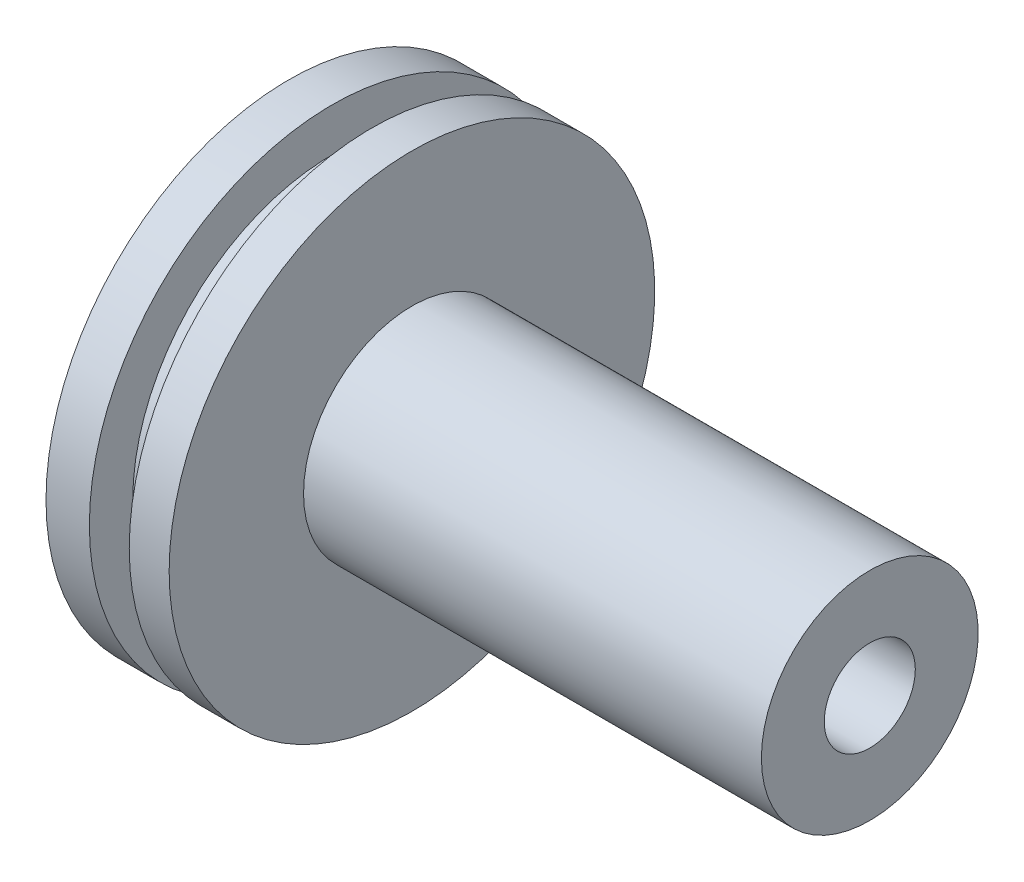
ISO-10303-21;
HEADER;
FILE_DESCRIPTION(('STEP AP214'),'2;1');
FILE_NAME('part.step','',(''),(''),'','','');
FILE_SCHEMA(('AUTOMOTIVE_DESIGN { 1 0 10303 214 1 1 1 1 }'));
ENDSEC;
DATA;
#1=APPLICATION_CONTEXT('core data for automotive mechanical design processes');
#2=APPLICATION_PROTOCOL_DEFINITION('international standard','automotive_design',2000,#1);
#3=PRODUCT_CONTEXT('',#1,'mechanical');
#4=PRODUCT('Part','Part','',(#3));
#5=PRODUCT_RELATED_PRODUCT_CATEGORY('part','',(#4));
#6=PRODUCT_DEFINITION_FORMATION('','',#4);
#7=PRODUCT_DEFINITION_CONTEXT('part definition',#1,'design');
#8=PRODUCT_DEFINITION('design','',#6,#7);
#9=PRODUCT_DEFINITION_SHAPE('','',#8);
#10=(LENGTH_UNIT() NAMED_UNIT(*) SI_UNIT(.MILLI.,.METRE.));
#11=(NAMED_UNIT(*) PLANE_ANGLE_UNIT() SI_UNIT($,.RADIAN.));
#12=(NAMED_UNIT(*) SI_UNIT($,.STERADIAN.) SOLID_ANGLE_UNIT());
#13=UNCERTAINTY_MEASURE_WITH_UNIT(LENGTH_MEASURE(1.E-05),#10,'distance_accuracy_value','');
#14=(GEOMETRIC_REPRESENTATION_CONTEXT(3) GLOBAL_UNCERTAINTY_ASSIGNED_CONTEXT((#13)) GLOBAL_UNIT_ASSIGNED_CONTEXT((#10,
#11,#12)) REPRESENTATION_CONTEXT('',''));
#15=CARTESIAN_POINT('',(0.,0.,0.));
#16=DIRECTION('',(0.,0.,1.));
#17=DIRECTION('',(1.,0.,0.));
#18=AXIS2_PLACEMENT_3D('',#15,#16,#17);
#19=CARTESIAN_POINT('',(0.,-12.5,0.));
#20=DIRECTION('',(1.,0.,0.));
#21=DIRECTION('',(0.,0.,-1.));
#22=AXIS2_PLACEMENT_3D('',#19,#20,#21);
#23=PLANE('',#22);
#24=CARTESIAN_POINT('',(0.,0.,0.));
#25=DIRECTION('',(1.,0.,0.));
#26=DIRECTION('',(0.,0.,-1.));
#27=AXIS2_PLACEMENT_3D('',#24,#25,#26);
#28=CIRCLE('',#27,5.24999999999999);
#29=CARTESIAN_POINT('',(0.,0.,-5.24999999999999));
#30=VERTEX_POINT('',#29);
#31=EDGE_CURVE('E56',#30,#30,#28,.T.);
#32=ORIENTED_EDGE('',*,*,#31,.F.);
#33=EDGE_LOOP('',(#32));
#34=FACE_BOUND('',#33,.T.);
#35=CARTESIAN_POINT('',(0.,0.,0.));
#36=DIRECTION('',(-1.,0.,0.));
#37=DIRECTION('',(0.,0.,1.));
#38=AXIS2_PLACEMENT_3D('',#35,#36,#37);
#39=CIRCLE('',#38,12.5);
#40=CARTESIAN_POINT('',(0.,0.,12.5));
#41=VERTEX_POINT('',#40);
#42=EDGE_CURVE('E55',#41,#41,#39,.T.);
#43=ORIENTED_EDGE('',*,*,#42,.F.);
#44=EDGE_LOOP('',(#43));
#45=FACE_BOUND('',#44,.T.);
#46=ADVANCED_FACE('F36',(#34,#45),#23,.T.);
#47=CARTESIAN_POINT('',(-70.,0.,0.));
#48=DIRECTION('',(-1.,0.,0.));
#49=DIRECTION('',(0.,0.,1.));
#50=AXIS2_PLACEMENT_3D('',#47,#48,#49);
#51=PLANE('',#50);
#52=CARTESIAN_POINT('',(-70.,0.,0.));
#53=DIRECTION('',(-1.,0.,0.));
#54=DIRECTION('',(0.,0.,1.));
#55=AXIS2_PLACEMENT_3D('',#52,#53,#54);
#56=CIRCLE('',#55,9.);
#57=CARTESIAN_POINT('',(-70.,0.,9.));
#58=VERTEX_POINT('',#57);
#59=EDGE_CURVE('E11',#58,#58,#56,.T.);
#60=ORIENTED_EDGE('',*,*,#59,.T.);
#61=EDGE_LOOP('',(#60));
#62=FACE_BOUND('',#61,.T.);
#63=ADVANCED_FACE('F101',(#62),#51,.T.);
#64=CARTESIAN_POINT('',(-70.,0.,0.));
#65=DIRECTION('',(1.,0.,0.));
#66=DIRECTION('',(0.,0.,-1.));
#67=AXIS2_PLACEMENT_3D('',#64,#65,#66);
#68=CONICAL_SURFACE('',#67,9.,0.855211333477219);
#69=CARTESIAN_POINT('',(-67.,0.,0.));
#70=DIRECTION('',(-1.,0.,0.));
#71=DIRECTION('',(0.,0.,1.));
#72=AXIS2_PLACEMENT_3D('',#69,#70,#71);
#73=CIRCLE('',#72,12.451105221663);
#74=CARTESIAN_POINT('',(-67.,0.,12.451105221663));
#75=VERTEX_POINT('',#74);
#76=EDGE_CURVE('E42',#75,#75,#73,.T.);
#77=ORIENTED_EDGE('',*,*,#76,.T.);
#78=EDGE_LOOP('',(#77));
#79=FACE_BOUND('',#78,.T.);
#80=ORIENTED_EDGE('',*,*,#59,.F.);
#81=EDGE_LOOP('',(#80));
#82=FACE_BOUND('',#81,.T.);
#83=ADVANCED_FACE('F86',(#79,#82),#68,.T.);
#84=CARTESIAN_POINT('',(-66.9999999999991,-12.451105221663,0.));
#85=DIRECTION('',(-1.,0.,0.));
#86=DIRECTION('',(0.,0.,1.));
#87=AXIS2_PLACEMENT_3D('',#84,#85,#86);
#88=PLANE('',#87);
#89=CARTESIAN_POINT('',(-66.9999999999981,0.,0.));
#90=DIRECTION('',(-1.,0.,0.));
#91=DIRECTION('',(0.,0.,1.));
#92=AXIS2_PLACEMENT_3D('',#89,#90,#91);
#93=CIRCLE('',#92,28.);
#94=CARTESIAN_POINT('',(-66.9999999999981,0.,28.));
#95=VERTEX_POINT('',#94);
#96=EDGE_CURVE('E81',#95,#95,#93,.T.);
#97=ORIENTED_EDGE('',*,*,#96,.T.);
#98=EDGE_LOOP('',(#97));
#99=FACE_BOUND('',#98,.T.);
#100=ORIENTED_EDGE('',*,*,#76,.F.);
#101=EDGE_LOOP('',(#100));
#102=FACE_BOUND('',#101,.T.);
#103=ADVANCED_FACE('F89',(#99,#102),#88,.T.);
#104=CARTESIAN_POINT('',(-541.044005746279,0.,0.));
#105=DIRECTION('',(-1.,0.,0.));
#106=DIRECTION('',(0.,0.,1.));
#107=AXIS2_PLACEMENT_3D('',#104,#105,#106);
#108=CYLINDRICAL_SURFACE('',#107,28.);
#109=CARTESIAN_POINT('',(-62.,0.,0.));
#110=DIRECTION('',(-1.,0.,0.));
#111=DIRECTION('',(0.,0.,1.));
#112=AXIS2_PLACEMENT_3D('',#109,#110,#111);
#113=CIRCLE('',#112,28.);
#114=CARTESIAN_POINT('',(-62.,0.,28.));
#115=VERTEX_POINT('',#114);
#116=EDGE_CURVE('E78',#115,#115,#113,.T.);
#117=ORIENTED_EDGE('',*,*,#116,.T.);
#118=EDGE_LOOP('',(#117));
#119=FACE_BOUND('',#118,.T.);
#120=ORIENTED_EDGE('',*,*,#96,.F.);
#121=EDGE_LOOP('',(#120));
#122=FACE_BOUND('',#121,.T.);
#123=ADVANCED_FACE('F91',(#119,#122),#108,.T.);
#124=CARTESIAN_POINT('',(-62.,-28.,0.));
#125=DIRECTION('',(1.,0.,0.));
#126=DIRECTION('',(0.,0.,-1.));
#127=AXIS2_PLACEMENT_3D('',#124,#125,#126);
#128=PLANE('',#127);
#129=CARTESIAN_POINT('',(-62.,0.,0.));
#130=DIRECTION('',(-1.,0.,0.));
#131=DIRECTION('',(0.,0.,1.));
#132=AXIS2_PLACEMENT_3D('',#129,#130,#131);
#133=CIRCLE('',#132,23.);
#134=CARTESIAN_POINT('',(-62.,0.,23.));
#135=VERTEX_POINT('',#134);
#136=EDGE_CURVE('E75',#135,#135,#133,.T.);
#137=ORIENTED_EDGE('',*,*,#136,.T.);
#138=EDGE_LOOP('',(#137));
#139=FACE_BOUND('',#138,.T.);
#140=ORIENTED_EDGE('',*,*,#116,.F.);
#141=EDGE_LOOP('',(#140));
#142=FACE_BOUND('',#141,.T.);
#143=ADVANCED_FACE('F98',(#139,#142),#128,.T.);
#144=CARTESIAN_POINT('',(-541.044005746279,0.,0.));
#145=DIRECTION('',(-1.,0.,0.));
#146=DIRECTION('',(0.,0.,1.));
#147=AXIS2_PLACEMENT_3D('',#144,#145,#146);
#148=CYLINDRICAL_SURFACE('',#147,23.);
#149=CARTESIAN_POINT('',(-57.4,0.,0.));
#150=DIRECTION('',(-1.,0.,0.));
#151=DIRECTION('',(0.,0.,1.));
#152=AXIS2_PLACEMENT_3D('',#149,#150,#151);
#153=CIRCLE('',#152,23.);
#154=CARTESIAN_POINT('',(-57.4,0.,23.));
#155=VERTEX_POINT('',#154);
#156=EDGE_CURVE('E72',#155,#155,#153,.T.);
#157=ORIENTED_EDGE('',*,*,#156,.T.);
#158=EDGE_LOOP('',(#157));
#159=FACE_BOUND('',#158,.T.);
#160=ORIENTED_EDGE('',*,*,#136,.F.);
#161=EDGE_LOOP('',(#160));
#162=FACE_BOUND('',#161,.T.);
#163=ADVANCED_FACE('F133',(#159,#162),#148,.T.);
#164=CARTESIAN_POINT('',(-57.4,-23.,0.));
#165=DIRECTION('',(-1.,0.,0.));
#166=DIRECTION('',(0.,0.,1.));
#167=AXIS2_PLACEMENT_3D('',#164,#165,#166);
#168=PLANE('',#167);
#169=CARTESIAN_POINT('',(-57.4,0.,0.));
#170=DIRECTION('',(-1.,0.,0.));
#171=DIRECTION('',(0.,0.,1.));
#172=AXIS2_PLACEMENT_3D('',#169,#170,#171);
#173=CIRCLE('',#172,28.);
#174=CARTESIAN_POINT('',(-57.4,0.,28.));
#175=VERTEX_POINT('',#174);
#176=EDGE_CURVE('E69',#175,#175,#173,.T.);
#177=ORIENTED_EDGE('',*,*,#176,.T.);
#178=EDGE_LOOP('',(#177));
#179=FACE_BOUND('',#178,.T.);
#180=ORIENTED_EDGE('',*,*,#156,.F.);
#181=EDGE_LOOP('',(#180));
#182=FACE_BOUND('',#181,.T.);
#183=ADVANCED_FACE('F127',(#179,#182),#168,.T.);
#184=CARTESIAN_POINT('',(-541.044005746279,0.,0.));
#185=DIRECTION('',(-1.,0.,0.));
#186=DIRECTION('',(0.,0.,1.));
#187=AXIS2_PLACEMENT_3D('',#184,#185,#186);
#188=CYLINDRICAL_SURFACE('',#187,28.);
#189=CARTESIAN_POINT('',(-52.8,0.,0.));
#190=DIRECTION('',(-1.,0.,0.));
#191=DIRECTION('',(0.,0.,1.));
#192=AXIS2_PLACEMENT_3D('',#189,#190,#191);
#193=CIRCLE('',#192,28.);
#194=CARTESIAN_POINT('',(-52.8,0.,28.));
#195=VERTEX_POINT('',#194);
#196=EDGE_CURVE('E66',#195,#195,#193,.T.);
#197=ORIENTED_EDGE('',*,*,#196,.T.);
#198=EDGE_LOOP('',(#197));
#199=FACE_BOUND('',#198,.T.);
#200=ORIENTED_EDGE('',*,*,#176,.F.);
#201=EDGE_LOOP('',(#200));
#202=FACE_BOUND('',#201,.T.);
#203=ADVANCED_FACE('F121',(#199,#202),#188,.T.);
#204=CARTESIAN_POINT('',(-52.8,-28.,0.));
#205=DIRECTION('',(1.,0.,0.));
#206=DIRECTION('',(0.,0.,-1.));
#207=AXIS2_PLACEMENT_3D('',#204,#205,#206);
#208=PLANE('',#207);
#209=CARTESIAN_POINT('',(-52.8,0.,0.));
#210=DIRECTION('',(-1.,0.,0.));
#211=DIRECTION('',(0.,0.,1.));
#212=AXIS2_PLACEMENT_3D('',#209,#210,#211);
#213=CIRCLE('',#212,12.5);
#214=CARTESIAN_POINT('',(-52.8,0.,12.5));
#215=VERTEX_POINT('',#214);
#216=EDGE_CURVE('E59',#215,#215,#213,.T.);
#217=ORIENTED_EDGE('',*,*,#216,.T.);
#218=EDGE_LOOP('',(#217));
#219=FACE_BOUND('',#218,.T.);
#220=ORIENTED_EDGE('',*,*,#196,.F.);
#221=EDGE_LOOP('',(#220));
#222=FACE_BOUND('',#221,.T.);
#223=ADVANCED_FACE('F115',(#219,#222),#208,.T.);
#224=CARTESIAN_POINT('',(-541.044005746279,0.,0.));
#225=DIRECTION('',(-1.,0.,0.));
#226=DIRECTION('',(0.,0.,1.));
#227=AXIS2_PLACEMENT_3D('',#224,#225,#226);
#228=CYLINDRICAL_SURFACE('',#227,12.5);
#229=ORIENTED_EDGE('',*,*,#42,.T.);
#230=EDGE_LOOP('',(#229));
#231=FACE_BOUND('',#230,.T.);
#232=ORIENTED_EDGE('',*,*,#216,.F.);
#233=EDGE_LOOP('',(#232));
#234=FACE_BOUND('',#233,.T.);
#235=ADVANCED_FACE('F49',(#231,#234),#228,.T.);
#236=CARTESIAN_POINT('',(-45.,0.,0.));
#237=DIRECTION('',(1.,0.,0.));
#238=DIRECTION('',(0.,0.,-1.));
#239=AXIS2_PLACEMENT_3D('',#236,#237,#238);
#240=CONICAL_SURFACE('',#239,5.24999999999999,1.02974425867665);
#241=CARTESIAN_POINT('',(-48.1545182498947,0.,0.));
#242=VERTEX_POINT('',#241);
#243=VERTEX_LOOP('',#242);
#244=FACE_BOUND('',#243,.T.);
#245=CARTESIAN_POINT('',(-45.,0.,0.));
#246=DIRECTION('',(1.,0.,0.));
#247=DIRECTION('',(0.,0.,-1.));
#248=AXIS2_PLACEMENT_3D('',#245,#246,#247);
#249=CIRCLE('',#248,5.24999999999999);
#250=CARTESIAN_POINT('',(-45.,0.,-5.24999999999999));
#251=VERTEX_POINT('',#250);
#252=EDGE_CURVE('E53',#251,#251,#249,.T.);
#253=ORIENTED_EDGE('',*,*,#252,.T.);
#254=EDGE_LOOP('',(#253));
#255=FACE_BOUND('',#254,.T.);
#256=ADVANCED_FACE('F45',(#244,#255),#240,.F.);
#257=CARTESIAN_POINT('',(0.,0.,0.));
#258=DIRECTION('',(1.,0.,0.));
#259=DIRECTION('',(0.,0.,-1.));
#260=AXIS2_PLACEMENT_3D('',#257,#258,#259);
#261=CYLINDRICAL_SURFACE('',#260,5.24999999999999);
#262=ORIENTED_EDGE('',*,*,#252,.F.);
#263=EDGE_LOOP('',(#262));
#264=FACE_BOUND('',#263,.T.);
#265=ORIENTED_EDGE('',*,*,#31,.T.);
#266=EDGE_LOOP('',(#265));
#267=FACE_BOUND('',#266,.T.);
#268=ADVANCED_FACE('F48',(#264,#267),#261,.F.);
#269=CLOSED_SHELL('',(#46,#63,#83,#103,#123,#143,#163,#183,#203,#223,#235,#256,#268));
#270=MANIFOLD_SOLID_BREP('B2',#269);
#271=ADVANCED_BREP_SHAPE_REPRESENTATION('',(#18,#270),#14);
#272=SHAPE_DEFINITION_REPRESENTATION(#9,#271);
ENDSEC;
END-ISO-10303-21;
